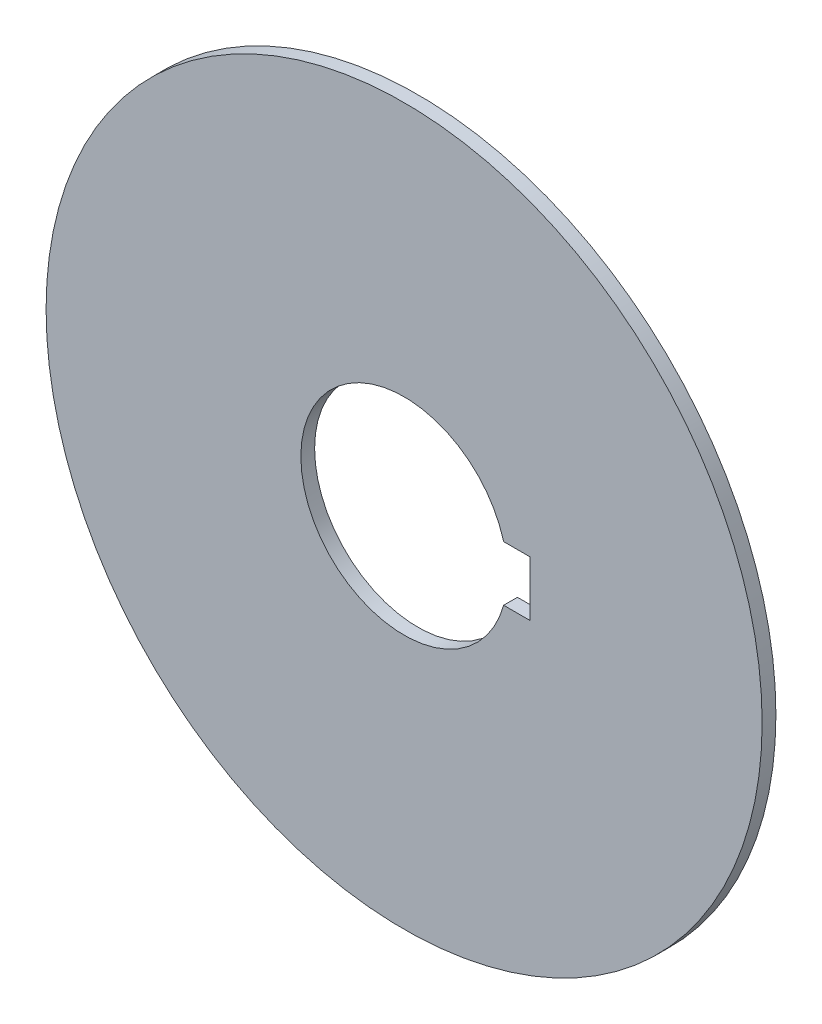
ISO-10303-21;
HEADER;
FILE_DESCRIPTION(('STEP AP214'),'2;1');
FILE_NAME('part.step','',(''),(''),'','','');
FILE_SCHEMA(('AUTOMOTIVE_DESIGN { 1 0 10303 214 1 1 1 1 }'));
ENDSEC;
DATA;
#1=APPLICATION_CONTEXT('core data for automotive mechanical design processes');
#2=APPLICATION_PROTOCOL_DEFINITION('international standard','automotive_design',2000,#1);
#3=PRODUCT_CONTEXT('',#1,'mechanical');
#4=PRODUCT('Part','Part','',(#3));
#5=PRODUCT_RELATED_PRODUCT_CATEGORY('part','',(#4));
#6=PRODUCT_DEFINITION_FORMATION('','',#4);
#7=PRODUCT_DEFINITION_CONTEXT('part definition',#1,'design');
#8=PRODUCT_DEFINITION('design','',#6,#7);
#9=PRODUCT_DEFINITION_SHAPE('','',#8);
#10=(LENGTH_UNIT() NAMED_UNIT(*) SI_UNIT(.MILLI.,.METRE.));
#11=(NAMED_UNIT(*) PLANE_ANGLE_UNIT() SI_UNIT($,.RADIAN.));
#12=(NAMED_UNIT(*) SI_UNIT($,.STERADIAN.) SOLID_ANGLE_UNIT());
#13=UNCERTAINTY_MEASURE_WITH_UNIT(LENGTH_MEASURE(1.E-05),#10,'distance_accuracy_value','');
#14=(GEOMETRIC_REPRESENTATION_CONTEXT(3) GLOBAL_UNCERTAINTY_ASSIGNED_CONTEXT((#13)) GLOBAL_UNIT_ASSIGNED_CONTEXT((#10,
#11,#12)) REPRESENTATION_CONTEXT('',''));
#15=CARTESIAN_POINT('',(0.,0.,0.));
#16=DIRECTION('',(0.,0.,1.));
#17=DIRECTION('',(1.,0.,0.));
#18=AXIS2_PLACEMENT_3D('',#15,#16,#17);
#19=CARTESIAN_POINT('',(14.,4.,-1.));
#20=DIRECTION('',(0.,1.,0.));
#21=DIRECTION('',(1.,0.,0.));
#22=AXIS2_PLACEMENT_3D('',#19,#20,#21);
#23=PLANE('',#22);
#24=DIRECTION('',(-1.,0.,0.));
#25=VECTOR('',#24,1.);
#26=CARTESIAN_POINT('',(7.,4.,2.));
#27=LINE('',#26,#25);
#28=CARTESIAN_POINT('',(18.3,4.,2.));
#29=VERTEX_POINT('',#28);
#30=CARTESIAN_POINT('',(14.456832294801,4.,2.));
#31=VERTEX_POINT('',#30);
#32=EDGE_CURVE('E110',#29,#31,#27,.T.);
#33=ORIENTED_EDGE('',*,*,#32,.T.);
#34=DIRECTION('',(0.,0.,1.));
#35=VECTOR('',#34,1.);
#36=CARTESIAN_POINT('',(14.456832294801,4.,0.));
#37=LINE('',#36,#35);
#38=CARTESIAN_POINT('',(14.456832294801,4.,0.));
#39=VERTEX_POINT('',#38);
#40=EDGE_CURVE('E34',#39,#31,#37,.T.);
#41=ORIENTED_EDGE('',*,*,#40,.F.);
#42=DIRECTION('',(-1.,0.,0.));
#43=VECTOR('',#42,1.);
#44=CARTESIAN_POINT('',(7.,4.,0.));
#45=LINE('',#44,#43);
#46=CARTESIAN_POINT('',(18.3,4.,0.));
#47=VERTEX_POINT('',#46);
#48=EDGE_CURVE('E96',#47,#39,#45,.T.);
#49=ORIENTED_EDGE('',*,*,#48,.F.);
#50=DIRECTION('',(0.,0.,1.));
#51=VECTOR('',#50,1.);
#52=CARTESIAN_POINT('',(18.3,4.,-1.));
#53=LINE('',#52,#51);
#54=EDGE_CURVE('E9',#47,#29,#53,.T.);
#55=ORIENTED_EDGE('',*,*,#54,.T.);
#56=EDGE_LOOP('',(#33,#41,#49,#55));
#57=FACE_BOUND('',#56,.T.);
#58=ADVANCED_FACE('F15',(#57),#23,.F.);
#59=CARTESIAN_POINT('',(18.3,-4.,-1.));
#60=DIRECTION('',(1.,0.,0.));
#61=DIRECTION('',(0.,1.,0.));
#62=AXIS2_PLACEMENT_3D('',#59,#60,#61);
#63=PLANE('',#62);
#64=DIRECTION('',(0.,1.,0.));
#65=VECTOR('',#64,1.);
#66=CARTESIAN_POINT('',(18.3,-2.,2.));
#67=LINE('',#66,#65);
#68=CARTESIAN_POINT('',(18.3,-4.,2.));
#69=VERTEX_POINT('',#68);
#70=EDGE_CURVE('E109',#69,#29,#67,.T.);
#71=ORIENTED_EDGE('',*,*,#70,.T.);
#72=ORIENTED_EDGE('',*,*,#54,.F.);
#73=DIRECTION('',(0.,1.,0.));
#74=VECTOR('',#73,1.);
#75=CARTESIAN_POINT('',(18.3,-2.,0.));
#76=LINE('',#75,#74);
#77=CARTESIAN_POINT('',(18.3,-4.,0.));
#78=VERTEX_POINT('',#77);
#79=EDGE_CURVE('E103',#78,#47,#76,.T.);
#80=ORIENTED_EDGE('',*,*,#79,.F.);
#81=DIRECTION('',(0.,0.,1.));
#82=VECTOR('',#81,1.);
#83=CARTESIAN_POINT('',(18.3,-4.,-1.));
#84=LINE('',#83,#82);
#85=EDGE_CURVE('E18',#78,#69,#84,.T.);
#86=ORIENTED_EDGE('',*,*,#85,.T.);
#87=EDGE_LOOP('',(#71,#72,#80,#86));
#88=FACE_BOUND('',#87,.T.);
#89=ADVANCED_FACE('F132',(#88),#63,.F.);
#90=CARTESIAN_POINT('',(14.,-4.,-1.));
#91=DIRECTION('',(0.,1.,0.));
#92=DIRECTION('',(1.,0.,0.));
#93=AXIS2_PLACEMENT_3D('',#90,#91,#92);
#94=PLANE('',#93);
#95=ORIENTED_EDGE('',*,*,#85,.F.);
#96=DIRECTION('',(-1.,0.,0.));
#97=VECTOR('',#96,1.);
#98=CARTESIAN_POINT('',(7.,-4.,0.));
#99=LINE('',#98,#97);
#100=CARTESIAN_POINT('',(14.456832294801,-4.,0.));
#101=VERTEX_POINT('',#100);
#102=EDGE_CURVE('E117',#78,#101,#99,.T.);
#103=ORIENTED_EDGE('',*,*,#102,.T.);
#104=DIRECTION('',(0.,0.,1.));
#105=VECTOR('',#104,1.);
#106=CARTESIAN_POINT('',(14.456832294801,-4.,0.));
#107=LINE('',#106,#105);
#108=CARTESIAN_POINT('',(14.456832294801,-4.,2.));
#109=VERTEX_POINT('',#108);
#110=EDGE_CURVE('E92',#101,#109,#107,.T.);
#111=ORIENTED_EDGE('',*,*,#110,.T.);
#112=DIRECTION('',(-1.,0.,0.));
#113=VECTOR('',#112,1.);
#114=CARTESIAN_POINT('',(7.,-4.,2.));
#115=LINE('',#114,#113);
#116=EDGE_CURVE('E114',#69,#109,#115,.T.);
#117=ORIENTED_EDGE('',*,*,#116,.F.);
#118=EDGE_LOOP('',(#95,#103,#111,#117));
#119=FACE_BOUND('',#118,.T.);
#120=ADVANCED_FACE('F138',(#119),#94,.T.);
#121=CARTESIAN_POINT('',(0.,0.,0.));
#122=DIRECTION('',(0.,0.,1.));
#123=DIRECTION('',(1.,0.,0.));
#124=AXIS2_PLACEMENT_3D('',#121,#122,#123);
#125=CYLINDRICAL_SURFACE('',#124,15.);
#126=ORIENTED_EDGE('',*,*,#110,.F.);
#127=CARTESIAN_POINT('',(0.,0.,0.));
#128=DIRECTION('',(0.,0.,1.));
#129=DIRECTION('',(1.,0.,0.));
#130=AXIS2_PLACEMENT_3D('',#127,#128,#129);
#131=CIRCLE('',#130,15.);
#132=EDGE_CURVE('E93',#39,#101,#131,.T.);
#133=ORIENTED_EDGE('',*,*,#132,.F.);
#134=ORIENTED_EDGE('',*,*,#40,.T.);
#135=CARTESIAN_POINT('',(0.,0.,2.));
#136=DIRECTION('',(0.,0.,1.));
#137=DIRECTION('',(1.,0.,0.));
#138=AXIS2_PLACEMENT_3D('',#135,#136,#137);
#139=CIRCLE('',#138,15.);
#140=EDGE_CURVE('E97',#31,#109,#139,.T.);
#141=ORIENTED_EDGE('',*,*,#140,.T.);
#142=EDGE_LOOP('',(#126,#133,#134,#141));
#143=FACE_BOUND('',#142,.T.);
#144=ADVANCED_FACE('F145',(#143),#125,.F.);
#145=CARTESIAN_POINT('',(0.,0.,0.));
#146=DIRECTION('',(0.,0.,1.));
#147=DIRECTION('',(1.,0.,0.));
#148=AXIS2_PLACEMENT_3D('',#145,#146,#147);
#149=PLANE('',#148);
#150=ORIENTED_EDGE('',*,*,#102,.F.);
#151=ORIENTED_EDGE('',*,*,#79,.T.);
#152=ORIENTED_EDGE('',*,*,#48,.T.);
#153=ORIENTED_EDGE('',*,*,#132,.T.);
#154=EDGE_LOOP('',(#150,#151,#152,#153));
#155=FACE_BOUND('',#154,.T.);
#156=CARTESIAN_POINT('',(0.,0.,0.));
#157=DIRECTION('',(0.,0.,1.));
#158=DIRECTION('',(1.,0.,0.));
#159=AXIS2_PLACEMENT_3D('',#156,#157,#158);
#160=CIRCLE('',#159,52.);
#161=CARTESIAN_POINT('',(52.,0.,0.));
#162=VERTEX_POINT('',#161);
#163=EDGE_CURVE('E85',#162,#162,#160,.T.);
#164=ORIENTED_EDGE('',*,*,#163,.F.);
#165=EDGE_LOOP('',(#164));
#166=FACE_BOUND('',#165,.T.);
#167=ADVANCED_FACE('F142',(#155,#166),#149,.F.);
#168=CARTESIAN_POINT('',(0.,0.,2.));
#169=DIRECTION('',(0.,0.,1.));
#170=DIRECTION('',(1.,0.,0.));
#171=AXIS2_PLACEMENT_3D('',#168,#169,#170);
#172=PLANE('',#171);
#173=ORIENTED_EDGE('',*,*,#140,.F.);
#174=ORIENTED_EDGE('',*,*,#32,.F.);
#175=ORIENTED_EDGE('',*,*,#70,.F.);
#176=ORIENTED_EDGE('',*,*,#116,.T.);
#177=EDGE_LOOP('',(#173,#174,#175,#176));
#178=FACE_BOUND('',#177,.T.);
#179=CARTESIAN_POINT('',(0.,0.,2.));
#180=DIRECTION('',(0.,0.,1.));
#181=DIRECTION('',(1.,0.,0.));
#182=AXIS2_PLACEMENT_3D('',#179,#180,#181);
#183=CIRCLE('',#182,52.);
#184=CARTESIAN_POINT('',(52.,0.,2.));
#185=VERTEX_POINT('',#184);
#186=EDGE_CURVE('E79',#185,#185,#183,.T.);
#187=ORIENTED_EDGE('',*,*,#186,.T.);
#188=EDGE_LOOP('',(#187));
#189=FACE_BOUND('',#188,.T.);
#190=ADVANCED_FACE('F88',(#178,#189),#172,.T.);
#191=CARTESIAN_POINT('',(0.,0.,0.));
#192=DIRECTION('',(0.,0.,1.));
#193=DIRECTION('',(1.,0.,0.));
#194=AXIS2_PLACEMENT_3D('',#191,#192,#193);
#195=CYLINDRICAL_SURFACE('',#194,52.);
#196=ORIENTED_EDGE('',*,*,#186,.F.);
#197=DIRECTION('',(0.,0.,1.));
#198=VECTOR('',#197,1.);
#199=CARTESIAN_POINT('',(52.,0.,0.));
#200=LINE('',#199,#198);
#201=EDGE_CURVE('E80',#162,#185,#200,.T.);
#202=ORIENTED_EDGE('',*,*,#201,.F.);
#203=ORIENTED_EDGE('',*,*,#163,.T.);
#204=ORIENTED_EDGE('',*,*,#201,.T.);
#205=EDGE_LOOP('',(#196,#202,#203,#204));
#206=FACE_BOUND('',#205,.T.);
#207=ADVANCED_FACE('F78',(#206),#195,.T.);
#208=CLOSED_SHELL('',(#58,#89,#120,#144,#167,#190,#207));
#209=MANIFOLD_SOLID_BREP('B1',#208);
#210=ADVANCED_BREP_SHAPE_REPRESENTATION('',(#18,#209),#14);
#211=SHAPE_DEFINITION_REPRESENTATION(#9,#210);
ENDSEC;
END-ISO-10303-21;
